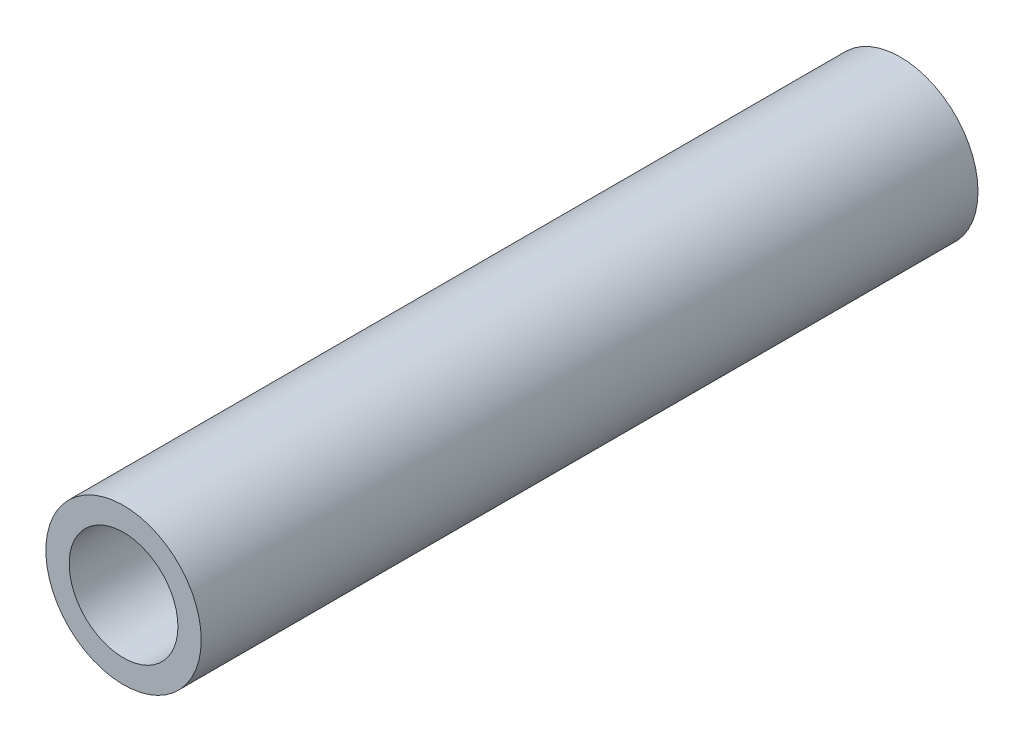
ISO-10303-21;
HEADER;
FILE_DESCRIPTION(('STEP AP214'),'2;1');
FILE_NAME('part.step','',(''),(''),'','','');
FILE_SCHEMA(('AUTOMOTIVE_DESIGN { 1 0 10303 214 1 1 1 1 }'));
ENDSEC;
DATA;
#1=APPLICATION_CONTEXT('core data for automotive mechanical design processes');
#2=APPLICATION_PROTOCOL_DEFINITION('international standard','automotive_design',2000,#1);
#3=PRODUCT_CONTEXT('',#1,'mechanical');
#4=PRODUCT('Part','Part','',(#3));
#5=PRODUCT_RELATED_PRODUCT_CATEGORY('part','',(#4));
#6=PRODUCT_DEFINITION_FORMATION('','',#4);
#7=PRODUCT_DEFINITION_CONTEXT('part definition',#1,'design');
#8=PRODUCT_DEFINITION('design','',#6,#7);
#9=PRODUCT_DEFINITION_SHAPE('','',#8);
#10=(LENGTH_UNIT() NAMED_UNIT(*) SI_UNIT(.MILLI.,.METRE.));
#11=(NAMED_UNIT(*) PLANE_ANGLE_UNIT() SI_UNIT($,.RADIAN.));
#12=(NAMED_UNIT(*) SI_UNIT($,.STERADIAN.) SOLID_ANGLE_UNIT());
#13=UNCERTAINTY_MEASURE_WITH_UNIT(LENGTH_MEASURE(1.E-05),#10,'distance_accuracy_value','');
#14=(GEOMETRIC_REPRESENTATION_CONTEXT(3) GLOBAL_UNCERTAINTY_ASSIGNED_CONTEXT((#13)) GLOBAL_UNIT_ASSIGNED_CONTEXT((#10,
#11,#12)) REPRESENTATION_CONTEXT('',''));
#15=CARTESIAN_POINT('',(0.,0.,0.));
#16=DIRECTION('',(0.,0.,1.));
#17=DIRECTION('',(1.,0.,0.));
#18=AXIS2_PLACEMENT_3D('',#15,#16,#17);
#19=CARTESIAN_POINT('',(0.,0.,30.));
#20=DIRECTION('',(0.,0.,1.));
#21=DIRECTION('',(1.,0.,0.));
#22=AXIS2_PLACEMENT_3D('',#19,#20,#21);
#23=PLANE('',#22);
#24=CARTESIAN_POINT('',(0.,0.,30.));
#25=DIRECTION('',(0.,0.,1.));
#26=DIRECTION('',(1.,0.,0.));
#27=AXIS2_PLACEMENT_3D('',#24,#25,#26);
#28=CIRCLE('',#27,3.);
#29=CARTESIAN_POINT('',(3.,0.,30.));
#30=VERTEX_POINT('',#29);
#31=EDGE_CURVE('E10',#30,#30,#28,.T.);
#32=ORIENTED_EDGE('',*,*,#31,.T.);
#33=EDGE_LOOP('',(#32));
#34=FACE_BOUND('',#33,.T.);
#35=CARTESIAN_POINT('',(0.,0.,30.));
#36=DIRECTION('',(0.,0.,1.));
#37=DIRECTION('',(1.,0.,0.));
#38=AXIS2_PLACEMENT_3D('',#35,#36,#37);
#39=CIRCLE('',#38,2.1);
#40=CARTESIAN_POINT('',(2.1,0.,30.));
#41=VERTEX_POINT('',#40);
#42=EDGE_CURVE('E41',#41,#41,#39,.T.);
#43=ORIENTED_EDGE('',*,*,#42,.F.);
#44=EDGE_LOOP('',(#43));
#45=FACE_BOUND('',#44,.T.);
#46=ADVANCED_FACE('F30',(#34,#45),#23,.T.);
#47=CARTESIAN_POINT('',(0.,0.,0.));
#48=DIRECTION('',(0.,0.,1.));
#49=DIRECTION('',(1.,0.,0.));
#50=AXIS2_PLACEMENT_3D('',#47,#48,#49);
#51=PLANE('',#50);
#52=CARTESIAN_POINT('',(0.,0.,0.));
#53=DIRECTION('',(0.,0.,1.));
#54=DIRECTION('',(1.,0.,0.));
#55=AXIS2_PLACEMENT_3D('',#52,#53,#54);
#56=CIRCLE('',#55,3.);
#57=CARTESIAN_POINT('',(3.,0.,0.));
#58=VERTEX_POINT('',#57);
#59=EDGE_CURVE('E34',#58,#58,#56,.T.);
#60=ORIENTED_EDGE('',*,*,#59,.F.);
#61=EDGE_LOOP('',(#60));
#62=FACE_BOUND('',#61,.T.);
#63=CARTESIAN_POINT('',(0.,0.,0.));
#64=DIRECTION('',(0.,0.,1.));
#65=DIRECTION('',(1.,0.,0.));
#66=AXIS2_PLACEMENT_3D('',#63,#64,#65);
#67=CIRCLE('',#66,2.1);
#68=CARTESIAN_POINT('',(2.1,0.,0.));
#69=VERTEX_POINT('',#68);
#70=EDGE_CURVE('E43',#69,#69,#67,.T.);
#71=ORIENTED_EDGE('',*,*,#70,.T.);
#72=EDGE_LOOP('',(#71));
#73=FACE_BOUND('',#72,.T.);
#74=ADVANCED_FACE('F53',(#62,#73),#51,.F.);
#75=CARTESIAN_POINT('',(0.,0.,30.));
#76=DIRECTION('',(0.,0.,-1.));
#77=DIRECTION('',(-1.,0.,0.));
#78=AXIS2_PLACEMENT_3D('',#75,#76,#77);
#79=CYLINDRICAL_SURFACE('',#78,3.);
#80=ORIENTED_EDGE('',*,*,#31,.F.);
#81=EDGE_LOOP('',(#80));
#82=FACE_BOUND('',#81,.T.);
#83=ORIENTED_EDGE('',*,*,#59,.T.);
#84=EDGE_LOOP('',(#83));
#85=FACE_BOUND('',#84,.T.);
#86=ADVANCED_FACE('F32',(#82,#85),#79,.T.);
#87=CARTESIAN_POINT('',(0.,0.,30.));
#88=DIRECTION('',(0.,0.,-1.));
#89=DIRECTION('',(-1.,0.,0.));
#90=AXIS2_PLACEMENT_3D('',#87,#88,#89);
#91=CYLINDRICAL_SURFACE('',#90,2.1);
#92=ORIENTED_EDGE('',*,*,#42,.T.);
#93=EDGE_LOOP('',(#92));
#94=FACE_BOUND('',#93,.T.);
#95=ORIENTED_EDGE('',*,*,#70,.F.);
#96=EDGE_LOOP('',(#95));
#97=FACE_BOUND('',#96,.T.);
#98=ADVANCED_FACE('F49',(#94,#97),#91,.F.);
#99=CLOSED_SHELL('',(#46,#74,#86,#98));
#100=MANIFOLD_SOLID_BREP('B2',#99);
#101=ADVANCED_BREP_SHAPE_REPRESENTATION('',(#18,#100),#14);
#102=SHAPE_DEFINITION_REPRESENTATION(#9,#101);
ENDSEC;
END-ISO-10303-21;
